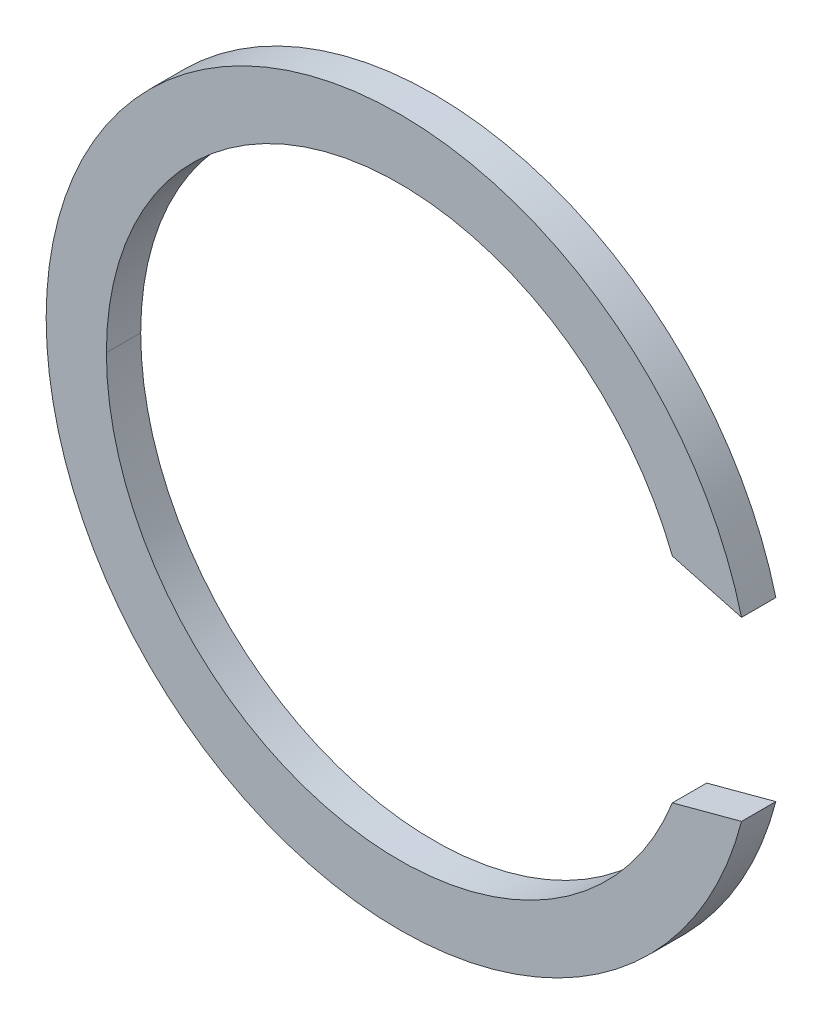
ISO-10303-21;
HEADER;
FILE_DESCRIPTION(('STEP AP214'),'2;1');
FILE_NAME('part.step','',(''),(''),'','','');
FILE_SCHEMA(('AUTOMOTIVE_DESIGN { 1 0 10303 214 1 1 1 1 }'));
ENDSEC;
DATA;
#1=APPLICATION_CONTEXT('core data for automotive mechanical design processes');
#2=APPLICATION_PROTOCOL_DEFINITION('international standard','automotive_design',2000,#1);
#3=PRODUCT_CONTEXT('',#1,'mechanical');
#4=PRODUCT('Part','Part','',(#3));
#5=PRODUCT_RELATED_PRODUCT_CATEGORY('part','',(#4));
#6=PRODUCT_DEFINITION_FORMATION('','',#4);
#7=PRODUCT_DEFINITION_CONTEXT('part definition',#1,'design');
#8=PRODUCT_DEFINITION('design','',#6,#7);
#9=PRODUCT_DEFINITION_SHAPE('','',#8);
#10=(LENGTH_UNIT() NAMED_UNIT(*) SI_UNIT(.MILLI.,.METRE.));
#11=(NAMED_UNIT(*) PLANE_ANGLE_UNIT() SI_UNIT($,.RADIAN.));
#12=(NAMED_UNIT(*) SI_UNIT($,.STERADIAN.) SOLID_ANGLE_UNIT());
#13=UNCERTAINTY_MEASURE_WITH_UNIT(LENGTH_MEASURE(1.E-05),#10,'distance_accuracy_value','');
#14=(GEOMETRIC_REPRESENTATION_CONTEXT(3) GLOBAL_UNCERTAINTY_ASSIGNED_CONTEXT((#13)) GLOBAL_UNIT_ASSIGNED_CONTEXT((#10,
#11,#12)) REPRESENTATION_CONTEXT('',''));
#15=CARTESIAN_POINT('',(0.,0.,0.));
#16=DIRECTION('',(0.,0.,1.));
#17=DIRECTION('',(1.,0.,0.));
#18=AXIS2_PLACEMENT_3D('',#15,#16,#17);
#19=CARTESIAN_POINT('',(0.,0.,0.));
#20=DIRECTION('',(0.,0.,1.));
#21=DIRECTION('',(1.,0.,0.));
#22=AXIS2_PLACEMENT_3D('',#19,#20,#21);
#23=PLANE('',#22);
#24=CARTESIAN_POINT('',(0.,0.,0.));
#25=DIRECTION('',(0.,0.,1.));
#26=DIRECTION('',(1.,0.,0.));
#27=AXIS2_PLACEMENT_3D('',#24,#25,#26);
#28=CIRCLE('',#27,9.68);
#29=CARTESIAN_POINT('',(9.37261969782195,2.42,0.));
#30=VERTEX_POINT('',#29);
#31=CARTESIAN_POINT('',(-9.68,0.,0.));
#32=VERTEX_POINT('',#31);
#33=EDGE_CURVE('E105',#30,#32,#28,.T.);
#34=ORIENTED_EDGE('',*,*,#33,.F.);
#35=DIRECTION('',(0.96592582628907,-0.258819045102515,0.));
#36=VECTOR('',#35,1.);
#37=CARTESIAN_POINT('',(9.37261969782195,2.42,0.));
#38=LINE('',#37,#36);
#39=CARTESIAN_POINT('',(7.47719411671023,2.92787775377217,0.));
#40=VERTEX_POINT('',#39);
#41=EDGE_CURVE('E25',#40,#30,#38,.T.);
#42=ORIENTED_EDGE('',*,*,#41,.F.);
#43=CARTESIAN_POINT('',(0.,0.,0.));
#44=DIRECTION('',(0.,0.,-1.));
#45=DIRECTION('',(1.,0.,0.));
#46=AXIS2_PLACEMENT_3D('',#43,#44,#45);
#47=CIRCLE('',#46,8.03);
#48=CARTESIAN_POINT('',(-8.03,0.,0.));
#49=VERTEX_POINT('',#48);
#50=EDGE_CURVE('E103',#49,#40,#47,.T.);
#51=ORIENTED_EDGE('',*,*,#50,.F.);
#52=CARTESIAN_POINT('',(0.,0.,0.));
#53=DIRECTION('',(0.,0.,-1.));
#54=DIRECTION('',(1.,0.,0.));
#55=AXIS2_PLACEMENT_3D('',#52,#53,#54);
#56=CIRCLE('',#55,8.03);
#57=CARTESIAN_POINT('',(7.47719411671023,-2.92787775377217,0.));
#58=VERTEX_POINT('',#57);
#59=EDGE_CURVE('E52',#58,#49,#56,.T.);
#60=ORIENTED_EDGE('',*,*,#59,.F.);
#61=DIRECTION('',(-0.96592582628907,-0.258819045102515,0.));
#62=VECTOR('',#61,1.);
#63=CARTESIAN_POINT('',(9.37261969782195,-2.42,0.));
#64=LINE('',#63,#62);
#65=CARTESIAN_POINT('',(9.37261969782195,-2.42,0.));
#66=VERTEX_POINT('',#65);
#67=EDGE_CURVE('E73',#66,#58,#64,.T.);
#68=ORIENTED_EDGE('',*,*,#67,.F.);
#69=CARTESIAN_POINT('',(0.,0.,0.));
#70=DIRECTION('',(0.,0.,1.));
#71=DIRECTION('',(1.,0.,0.));
#72=AXIS2_PLACEMENT_3D('',#69,#70,#71);
#73=CIRCLE('',#72,9.68);
#74=EDGE_CURVE('E133',#32,#66,#73,.T.);
#75=ORIENTED_EDGE('',*,*,#74,.F.);
#76=EDGE_LOOP('',(#34,#42,#51,#60,#68,#75));
#77=FACE_BOUND('',#76,.T.);
#78=ADVANCED_FACE('F17',(#77),#23,.F.);
#79=CARTESIAN_POINT('',(0.,0.,0.94));
#80=DIRECTION('',(0.,0.,1.));
#81=DIRECTION('',(1.,0.,0.));
#82=AXIS2_PLACEMENT_3D('',#79,#80,#81);
#83=PLANE('',#82);
#84=CARTESIAN_POINT('',(0.,0.,0.94));
#85=DIRECTION('',(0.,0.,1.));
#86=DIRECTION('',(1.,0.,0.));
#87=AXIS2_PLACEMENT_3D('',#84,#85,#86);
#88=CIRCLE('',#87,9.68);
#89=CARTESIAN_POINT('',(9.37261969782195,2.42,0.94));
#90=VERTEX_POINT('',#89);
#91=CARTESIAN_POINT('',(-9.68,0.,0.94));
#92=VERTEX_POINT('',#91);
#93=EDGE_CURVE('E147',#90,#92,#88,.T.);
#94=ORIENTED_EDGE('',*,*,#93,.T.);
#95=CARTESIAN_POINT('',(0.,0.,0.94));
#96=DIRECTION('',(0.,0.,1.));
#97=DIRECTION('',(1.,0.,0.));
#98=AXIS2_PLACEMENT_3D('',#95,#96,#97);
#99=CIRCLE('',#98,9.68);
#100=CARTESIAN_POINT('',(9.37261969782195,-2.42,0.94));
#101=VERTEX_POINT('',#100);
#102=EDGE_CURVE('E115',#92,#101,#99,.T.);
#103=ORIENTED_EDGE('',*,*,#102,.T.);
#104=DIRECTION('',(-0.96592582628907,-0.258819045102515,0.));
#105=VECTOR('',#104,1.);
#106=CARTESIAN_POINT('',(9.37261969782195,-2.42,0.94));
#107=LINE('',#106,#105);
#108=CARTESIAN_POINT('',(7.47719411671023,-2.92787775377217,0.94));
#109=VERTEX_POINT('',#108);
#110=EDGE_CURVE('E132',#101,#109,#107,.T.);
#111=ORIENTED_EDGE('',*,*,#110,.T.);
#112=CARTESIAN_POINT('',(0.,0.,0.94));
#113=DIRECTION('',(0.,0.,-1.));
#114=DIRECTION('',(1.,0.,0.));
#115=AXIS2_PLACEMENT_3D('',#112,#113,#114);
#116=CIRCLE('',#115,8.03);
#117=CARTESIAN_POINT('',(-8.03,0.,0.94));
#118=VERTEX_POINT('',#117);
#119=EDGE_CURVE('E38',#109,#118,#116,.T.);
#120=ORIENTED_EDGE('',*,*,#119,.T.);
#121=CARTESIAN_POINT('',(0.,0.,0.94));
#122=DIRECTION('',(0.,0.,-1.));
#123=DIRECTION('',(1.,0.,0.));
#124=AXIS2_PLACEMENT_3D('',#121,#122,#123);
#125=CIRCLE('',#124,8.03);
#126=CARTESIAN_POINT('',(7.47719411671023,2.92787775377217,0.94));
#127=VERTEX_POINT('',#126);
#128=EDGE_CURVE('E125',#118,#127,#125,.T.);
#129=ORIENTED_EDGE('',*,*,#128,.T.);
#130=DIRECTION('',(0.96592582628907,-0.258819045102515,0.));
#131=VECTOR('',#130,1.);
#132=CARTESIAN_POINT('',(9.37261969782195,2.42,0.94));
#133=LINE('',#132,#131);
#134=EDGE_CURVE('E11',#127,#90,#133,.T.);
#135=ORIENTED_EDGE('',*,*,#134,.T.);
#136=EDGE_LOOP('',(#94,#103,#111,#120,#129,#135));
#137=FACE_BOUND('',#136,.T.);
#138=ADVANCED_FACE('F204',(#137),#83,.T.);
#139=CARTESIAN_POINT('',(9.37261969782195,2.42,0.94));
#140=DIRECTION('',(0.258819045102515,0.96592582628907,0.));
#141=DIRECTION('',(0.,0.,-1.));
#142=AXIS2_PLACEMENT_3D('',#139,#140,#141);
#143=PLANE('',#142);
#144=ORIENTED_EDGE('',*,*,#41,.T.);
#145=DIRECTION('',(0.,0.,-1.));
#146=VECTOR('',#145,1.);
#147=CARTESIAN_POINT('',(9.37261969782195,2.42,0.94));
#148=LINE('',#147,#146);
#149=EDGE_CURVE('E128',#90,#30,#148,.T.);
#150=ORIENTED_EDGE('',*,*,#149,.F.);
#151=ORIENTED_EDGE('',*,*,#134,.F.);
#152=DIRECTION('',(0.,0.,-1.));
#153=VECTOR('',#152,1.);
#154=CARTESIAN_POINT('',(7.47719411671023,2.92787775377217,0.94));
#155=LINE('',#154,#153);
#156=EDGE_CURVE('E110',#127,#40,#155,.T.);
#157=ORIENTED_EDGE('',*,*,#156,.T.);
#158=EDGE_LOOP('',(#144,#150,#151,#157));
#159=FACE_BOUND('',#158,.T.);
#160=ADVANCED_FACE('F111',(#159),#143,.F.);
#161=CARTESIAN_POINT('',(0.,0.,0.94));
#162=DIRECTION('',(0.,0.,-1.));
#163=DIRECTION('',(-1.,0.,0.));
#164=AXIS2_PLACEMENT_3D('',#161,#162,#163);
#165=CYLINDRICAL_SURFACE('',#164,8.03);
#166=DIRECTION('',(0.,0.,-1.));
#167=VECTOR('',#166,1.);
#168=CARTESIAN_POINT('',(-8.03,0.,0.94));
#169=LINE('',#168,#167);
#170=EDGE_CURVE('E118',#118,#49,#169,.T.);
#171=ORIENTED_EDGE('',*,*,#170,.F.);
#172=ORIENTED_EDGE('',*,*,#119,.F.);
#173=DIRECTION('',(0.,0.,-1.));
#174=VECTOR('',#173,1.);
#175=CARTESIAN_POINT('',(7.47719411671023,-2.92787775377217,0.94));
#176=LINE('',#175,#174);
#177=EDGE_CURVE('E154',#109,#58,#176,.T.);
#178=ORIENTED_EDGE('',*,*,#177,.T.);
#179=ORIENTED_EDGE('',*,*,#59,.T.);
#180=EDGE_LOOP('',(#171,#172,#178,#179));
#181=FACE_BOUND('',#180,.T.);
#182=ADVANCED_FACE('F203',(#181),#165,.F.);
#183=CARTESIAN_POINT('',(9.37261969782195,-2.42,0.94));
#184=DIRECTION('',(0.258819045102515,-0.96592582628907,0.));
#185=DIRECTION('',(0.,0.,-1.));
#186=AXIS2_PLACEMENT_3D('',#183,#184,#185);
#187=PLANE('',#186);
#188=ORIENTED_EDGE('',*,*,#67,.T.);
#189=ORIENTED_EDGE('',*,*,#177,.F.);
#190=ORIENTED_EDGE('',*,*,#110,.F.);
#191=DIRECTION('',(0.,0.,-1.));
#192=VECTOR('',#191,1.);
#193=CARTESIAN_POINT('',(9.37261969782195,-2.42,0.94));
#194=LINE('',#193,#192);
#195=EDGE_CURVE('E137',#101,#66,#194,.T.);
#196=ORIENTED_EDGE('',*,*,#195,.T.);
#197=EDGE_LOOP('',(#188,#189,#190,#196));
#198=FACE_BOUND('',#197,.T.);
#199=ADVANCED_FACE('F215',(#198),#187,.F.);
#200=CARTESIAN_POINT('',(0.,0.,0.94));
#201=DIRECTION('',(0.,0.,-1.));
#202=DIRECTION('',(-1.,0.,0.));
#203=AXIS2_PLACEMENT_3D('',#200,#201,#202);
#204=CYLINDRICAL_SURFACE('',#203,9.68);
#205=DIRECTION('',(0.,0.,-1.));
#206=VECTOR('',#205,1.);
#207=CARTESIAN_POINT('',(-9.68,0.,0.94));
#208=LINE('',#207,#206);
#209=EDGE_CURVE('E138',#92,#32,#208,.T.);
#210=ORIENTED_EDGE('',*,*,#209,.F.);
#211=ORIENTED_EDGE('',*,*,#93,.F.);
#212=ORIENTED_EDGE('',*,*,#149,.T.);
#213=ORIENTED_EDGE('',*,*,#33,.T.);
#214=EDGE_LOOP('',(#210,#211,#212,#213));
#215=FACE_BOUND('',#214,.T.);
#216=ADVANCED_FACE('F191',(#215),#204,.T.);
#217=CARTESIAN_POINT('',(0.,0.,0.94));
#218=DIRECTION('',(0.,0.,-1.));
#219=DIRECTION('',(-1.,0.,0.));
#220=AXIS2_PLACEMENT_3D('',#217,#218,#219);
#221=CYLINDRICAL_SURFACE('',#220,9.68);
#222=ORIENTED_EDGE('',*,*,#102,.F.);
#223=ORIENTED_EDGE('',*,*,#209,.T.);
#224=ORIENTED_EDGE('',*,*,#74,.T.);
#225=ORIENTED_EDGE('',*,*,#195,.F.);
#226=EDGE_LOOP('',(#222,#223,#224,#225));
#227=FACE_BOUND('',#226,.T.);
#228=ADVANCED_FACE('F180',(#227),#221,.T.);
#229=CARTESIAN_POINT('',(0.,0.,0.94));
#230=DIRECTION('',(0.,0.,-1.));
#231=DIRECTION('',(-1.,0.,0.));
#232=AXIS2_PLACEMENT_3D('',#229,#230,#231);
#233=CYLINDRICAL_SURFACE('',#232,8.03);
#234=ORIENTED_EDGE('',*,*,#128,.F.);
#235=ORIENTED_EDGE('',*,*,#170,.T.);
#236=ORIENTED_EDGE('',*,*,#50,.T.);
#237=ORIENTED_EDGE('',*,*,#156,.F.);
#238=EDGE_LOOP('',(#234,#235,#236,#237));
#239=FACE_BOUND('',#238,.T.);
#240=ADVANCED_FACE('F117',(#239),#233,.F.);
#241=CLOSED_SHELL('',(#78,#138,#160,#182,#199,#216,#228,#240));
#242=MANIFOLD_SOLID_BREP('B1',#241);
#243=ADVANCED_BREP_SHAPE_REPRESENTATION('',(#18,#242),#14);
#244=SHAPE_DEFINITION_REPRESENTATION(#9,#243);
ENDSEC;
END-ISO-10303-21;
